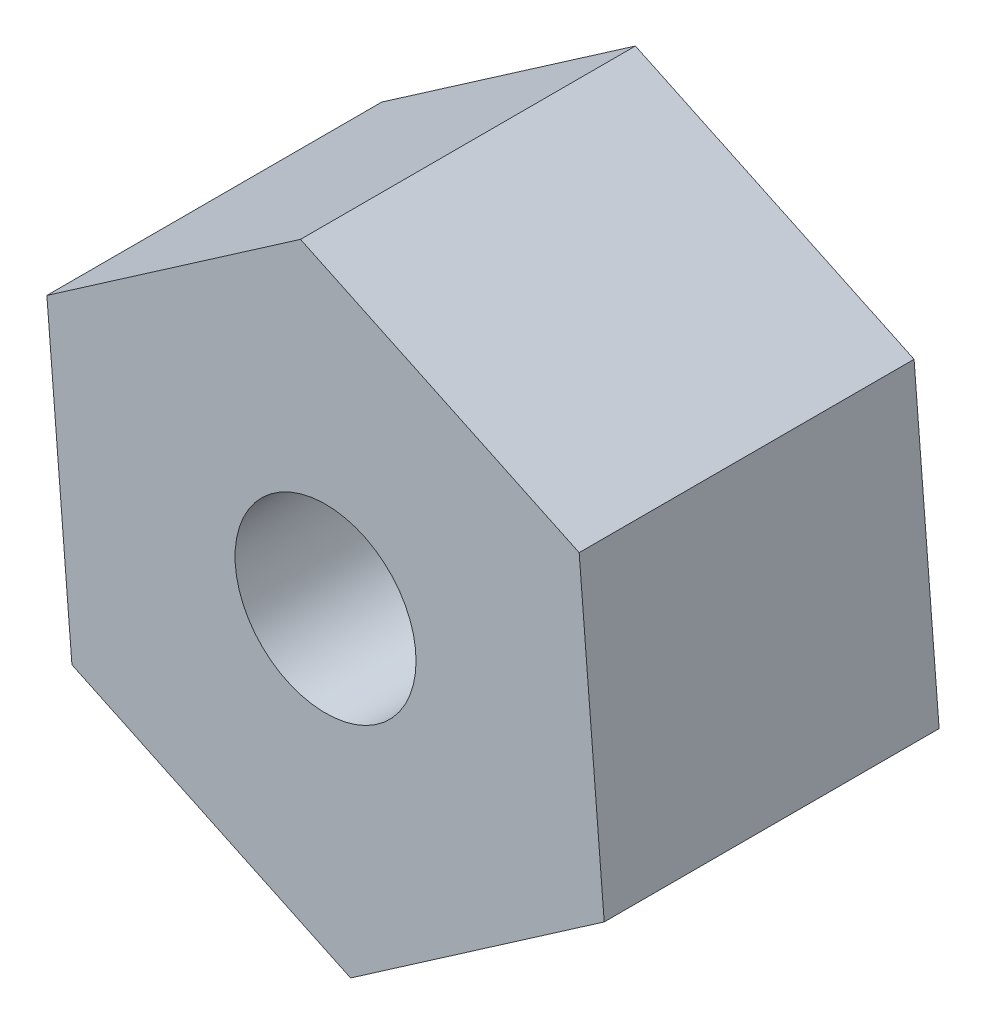
ISO-10303-21;
HEADER;
FILE_DESCRIPTION(('STEP AP214'),'2;1');
FILE_NAME('part.step','',(''),(''),'','','');
FILE_SCHEMA(('AUTOMOTIVE_DESIGN { 1 0 10303 214 1 1 1 1 }'));
ENDSEC;
DATA;
#1=APPLICATION_CONTEXT('core data for automotive mechanical design processes');
#2=APPLICATION_PROTOCOL_DEFINITION('international standard','automotive_design',2000,#1);
#3=PRODUCT_CONTEXT('',#1,'mechanical');
#4=PRODUCT('Part','Part','',(#3));
#5=PRODUCT_RELATED_PRODUCT_CATEGORY('part','',(#4));
#6=PRODUCT_DEFINITION_FORMATION('','',#4);
#7=PRODUCT_DEFINITION_CONTEXT('part definition',#1,'design');
#8=PRODUCT_DEFINITION('design','',#6,#7);
#9=PRODUCT_DEFINITION_SHAPE('','',#8);
#10=(LENGTH_UNIT() NAMED_UNIT(*) SI_UNIT(.MILLI.,.METRE.));
#11=(NAMED_UNIT(*) PLANE_ANGLE_UNIT() SI_UNIT($,.RADIAN.));
#12=(NAMED_UNIT(*) SI_UNIT($,.STERADIAN.) SOLID_ANGLE_UNIT());
#13=UNCERTAINTY_MEASURE_WITH_UNIT(LENGTH_MEASURE(1.E-05),#10,'distance_accuracy_value','');
#14=(GEOMETRIC_REPRESENTATION_CONTEXT(3) GLOBAL_UNCERTAINTY_ASSIGNED_CONTEXT((#13)) GLOBAL_UNIT_ASSIGNED_CONTEXT((#10,
#11,#12)) REPRESENTATION_CONTEXT('',''));
#15=CARTESIAN_POINT('',(0.,0.,0.));
#16=DIRECTION('',(0.,0.,1.));
#17=DIRECTION('',(1.,0.,0.));
#18=AXIS2_PLACEMENT_3D('',#15,#16,#17);
#19=CARTESIAN_POINT('',(0.,0.,3.7));
#20=DIRECTION('',(0.,0.,1.));
#21=DIRECTION('',(1.,0.,0.));
#22=AXIS2_PLACEMENT_3D('',#19,#20,#21);
#23=PLANE('',#22);
#24=DIRECTION('',(-0.903778262593263,0.428000995400599,0.));
#25=VECTOR('',#24,1.);
#26=CARTESIAN_POINT('',(2.80190297485983,1.93718172942163,3.7));
#27=LINE('',#26,#25);
#28=CARTESIAN_POINT('',(2.80190297485983,1.93718172942163,3.7));
#29=VERTEX_POINT('',#28);
#30=CARTESIAN_POINT('',(-0.276697101996294,3.39511001987862,3.7));
#31=VERTEX_POINT('',#30);
#32=EDGE_CURVE('E143',#29,#31,#27,.T.);
#33=ORIENTED_EDGE('',*,*,#32,.T.);
#34=DIRECTION('',(-0.822548866158576,-0.56869443709363,0.));
#35=VECTOR('',#34,1.);
#36=CARTESIAN_POINT('',(-0.276697101996294,3.39511001987862,3.7));
#37=LINE('',#36,#35);
#38=CARTESIAN_POINT('',(-3.07860007685612,1.45792829045698,3.7));
#39=VERTEX_POINT('',#38);
#40=EDGE_CURVE('E101',#31,#39,#37,.T.);
#41=ORIENTED_EDGE('',*,*,#40,.T.);
#42=DIRECTION('',(0.0812293964346863,-0.996695432494228,0.));
#43=VECTOR('',#42,1.);
#44=CARTESIAN_POINT('',(-3.07860007685612,1.45792829045698,3.7));
#45=LINE('',#44,#43);
#46=CARTESIAN_POINT('',(-2.80190297485983,-1.93718172942163,3.7));
#47=VERTEX_POINT('',#46);
#48=EDGE_CURVE('E114',#39,#47,#45,.T.);
#49=ORIENTED_EDGE('',*,*,#48,.T.);
#50=DIRECTION('',(0.903778262593263,-0.428000995400599,0.));
#51=VECTOR('',#50,1.);
#52=CARTESIAN_POINT('',(-2.80190297485983,-1.93718172942163,3.7));
#53=LINE('',#52,#51);
#54=CARTESIAN_POINT('',(0.276697101996293,-3.39511001987862,3.7));
#55=VERTEX_POINT('',#54);
#56=EDGE_CURVE('E108',#47,#55,#53,.T.);
#57=ORIENTED_EDGE('',*,*,#56,.T.);
#58=DIRECTION('',(0.822548866158576,0.56869443709363,0.));
#59=VECTOR('',#58,1.);
#60=CARTESIAN_POINT('',(0.276697101996293,-3.39511001987862,3.7));
#61=LINE('',#60,#59);
#62=CARTESIAN_POINT('',(3.07860007685612,-1.45792829045698,3.7));
#63=VERTEX_POINT('',#62);
#64=EDGE_CURVE('E112',#55,#63,#61,.T.);
#65=ORIENTED_EDGE('',*,*,#64,.T.);
#66=DIRECTION('',(-0.0812293964346861,0.996695432494228,0.));
#67=VECTOR('',#66,1.);
#68=CARTESIAN_POINT('',(3.07860007685612,-1.45792829045698,3.7));
#69=LINE('',#68,#67);
#70=EDGE_CURVE('E64',#63,#29,#69,.T.);
#71=ORIENTED_EDGE('',*,*,#70,.T.);
#72=EDGE_LOOP('',(#33,#41,#49,#57,#65,#71));
#73=FACE_BOUND('',#72,.T.);
#74=CARTESIAN_POINT('',(0.,0.,3.7));
#75=DIRECTION('',(0.,0.,1.));
#76=DIRECTION('',(1.,0.,0.));
#77=AXIS2_PLACEMENT_3D('',#74,#75,#76);
#78=CIRCLE('',#77,1.);
#79=CARTESIAN_POINT('',(1.,0.,3.7));
#80=VERTEX_POINT('',#79);
#81=EDGE_CURVE('E136',#80,#80,#78,.T.);
#82=ORIENTED_EDGE('',*,*,#81,.F.);
#83=EDGE_LOOP('',(#82));
#84=FACE_BOUND('',#83,.T.);
#85=ADVANCED_FACE('F47',(#73,#84),#23,.T.);
#86=CARTESIAN_POINT('',(0.,0.,0.));
#87=DIRECTION('',(0.,0.,1.));
#88=DIRECTION('',(1.,0.,0.));
#89=AXIS2_PLACEMENT_3D('',#86,#87,#88);
#90=PLANE('',#89);
#91=DIRECTION('',(-0.903778262593263,0.428000995400599,0.));
#92=VECTOR('',#91,1.);
#93=CARTESIAN_POINT('',(2.80190297485983,1.93718172942163,0.));
#94=LINE('',#93,#92);
#95=CARTESIAN_POINT('',(2.80190297485983,1.93718172942163,0.));
#96=VERTEX_POINT('',#95);
#97=CARTESIAN_POINT('',(-0.276697101996294,3.39511001987862,0.));
#98=VERTEX_POINT('',#97);
#99=EDGE_CURVE('E132',#96,#98,#94,.T.);
#100=ORIENTED_EDGE('',*,*,#99,.F.);
#101=DIRECTION('',(-0.0812293964346861,0.996695432494228,0.));
#102=VECTOR('',#101,1.);
#103=CARTESIAN_POINT('',(3.07860007685612,-1.45792829045698,0.));
#104=LINE('',#103,#102);
#105=CARTESIAN_POINT('',(3.07860007685612,-1.45792829045698,0.));
#106=VERTEX_POINT('',#105);
#107=EDGE_CURVE('E93',#106,#96,#104,.T.);
#108=ORIENTED_EDGE('',*,*,#107,.F.);
#109=DIRECTION('',(0.822548866158576,0.56869443709363,0.));
#110=VECTOR('',#109,1.);
#111=CARTESIAN_POINT('',(0.276697101996293,-3.39511001987862,0.));
#112=LINE('',#111,#110);
#113=CARTESIAN_POINT('',(0.276697101996293,-3.39511001987862,0.));
#114=VERTEX_POINT('',#113);
#115=EDGE_CURVE('E87',#114,#106,#112,.T.);
#116=ORIENTED_EDGE('',*,*,#115,.F.);
#117=DIRECTION('',(0.903778262593263,-0.428000995400599,0.));
#118=VECTOR('',#117,1.);
#119=CARTESIAN_POINT('',(-2.80190297485983,-1.93718172942163,0.));
#120=LINE('',#119,#118);
#121=CARTESIAN_POINT('',(-2.80190297485983,-1.93718172942163,0.));
#122=VERTEX_POINT('',#121);
#123=EDGE_CURVE('E122',#122,#114,#120,.T.);
#124=ORIENTED_EDGE('',*,*,#123,.F.);
#125=DIRECTION('',(0.0812293964346863,-0.996695432494228,0.));
#126=VECTOR('',#125,1.);
#127=CARTESIAN_POINT('',(-3.07860007685612,1.45792829045698,0.));
#128=LINE('',#127,#126);
#129=CARTESIAN_POINT('',(-3.07860007685612,1.45792829045698,0.));
#130=VERTEX_POINT('',#129);
#131=EDGE_CURVE('E138',#130,#122,#128,.T.);
#132=ORIENTED_EDGE('',*,*,#131,.F.);
#133=DIRECTION('',(-0.822548866158576,-0.56869443709363,0.));
#134=VECTOR('',#133,1.);
#135=CARTESIAN_POINT('',(-0.276697101996294,3.39511001987862,0.));
#136=LINE('',#135,#134);
#137=EDGE_CURVE('E135',#98,#130,#136,.T.);
#138=ORIENTED_EDGE('',*,*,#137,.F.);
#139=EDGE_LOOP('',(#100,#108,#116,#124,#132,#138));
#140=FACE_BOUND('',#139,.T.);
#141=CARTESIAN_POINT('',(0.,0.,0.));
#142=DIRECTION('',(0.,0.,1.));
#143=DIRECTION('',(1.,0.,0.));
#144=AXIS2_PLACEMENT_3D('',#141,#142,#143);
#145=CIRCLE('',#144,1.);
#146=CARTESIAN_POINT('',(1.,0.,0.));
#147=VERTEX_POINT('',#146);
#148=EDGE_CURVE('E248',#147,#147,#145,.T.);
#149=ORIENTED_EDGE('',*,*,#148,.T.);
#150=EDGE_LOOP('',(#149));
#151=FACE_BOUND('',#150,.T.);
#152=ADVANCED_FACE('F152',(#140,#151),#90,.F.);
#153=CARTESIAN_POINT('',(2.80190297485983,1.93718172942163,3.7));
#154=DIRECTION('',(-0.428000995400598,-0.903778262593263,0.));
#155=DIRECTION('',(0.903778262593263,-0.428000995400598,0.));
#156=AXIS2_PLACEMENT_3D('',#153,#154,#155);
#157=PLANE('',#156);
#158=ORIENTED_EDGE('',*,*,#99,.T.);
#159=DIRECTION('',(0.,0.,-1.));
#160=VECTOR('',#159,1.);
#161=CARTESIAN_POINT('',(-0.276697101996294,3.39511001987862,3.7));
#162=LINE('',#161,#160);
#163=EDGE_CURVE('E11',#31,#98,#162,.T.);
#164=ORIENTED_EDGE('',*,*,#163,.F.);
#165=ORIENTED_EDGE('',*,*,#32,.F.);
#166=DIRECTION('',(0.,0.,-1.));
#167=VECTOR('',#166,1.);
#168=CARTESIAN_POINT('',(2.80190297485983,1.93718172942163,3.7));
#169=LINE('',#168,#167);
#170=EDGE_CURVE('E128',#29,#96,#169,.T.);
#171=ORIENTED_EDGE('',*,*,#170,.T.);
#172=EDGE_LOOP('',(#158,#164,#165,#171));
#173=FACE_BOUND('',#172,.T.);
#174=ADVANCED_FACE('F49',(#173),#157,.F.);
#175=CARTESIAN_POINT('',(-0.276697101996294,3.39511001987862,3.7));
#176=DIRECTION('',(0.56869443709363,-0.822548866158577,0.));
#177=DIRECTION('',(0.822548866158576,0.56869443709363,0.));
#178=AXIS2_PLACEMENT_3D('',#175,#176,#177);
#179=PLANE('',#178);
#180=ORIENTED_EDGE('',*,*,#137,.T.);
#181=DIRECTION('',(0.,0.,-1.));
#182=VECTOR('',#181,1.);
#183=CARTESIAN_POINT('',(-3.07860007685612,1.45792829045698,3.7));
#184=LINE('',#183,#182);
#185=EDGE_CURVE('E56',#39,#130,#184,.T.);
#186=ORIENTED_EDGE('',*,*,#185,.F.);
#187=ORIENTED_EDGE('',*,*,#40,.F.);
#188=ORIENTED_EDGE('',*,*,#163,.T.);
#189=EDGE_LOOP('',(#180,#186,#187,#188));
#190=FACE_BOUND('',#189,.T.);
#191=ADVANCED_FACE('F180',(#190),#179,.F.);
#192=CARTESIAN_POINT('',(-3.07860007685612,1.45792829045698,3.7));
#193=DIRECTION('',(0.996695432494228,0.0812293964346863,0.));
#194=DIRECTION('',(-0.0812293964346863,0.996695432494228,0.));
#195=AXIS2_PLACEMENT_3D('',#192,#193,#194);
#196=PLANE('',#195);
#197=ORIENTED_EDGE('',*,*,#131,.T.);
#198=DIRECTION('',(0.,0.,-1.));
#199=VECTOR('',#198,1.);
#200=CARTESIAN_POINT('',(-2.80190297485983,-1.93718172942163,3.7));
#201=LINE('',#200,#199);
#202=EDGE_CURVE('E123',#47,#122,#201,.T.);
#203=ORIENTED_EDGE('',*,*,#202,.F.);
#204=ORIENTED_EDGE('',*,*,#48,.F.);
#205=ORIENTED_EDGE('',*,*,#185,.T.);
#206=EDGE_LOOP('',(#197,#203,#204,#205));
#207=FACE_BOUND('',#206,.T.);
#208=ADVANCED_FACE('F149',(#207),#196,.F.);
#209=CARTESIAN_POINT('',(-2.80190297485983,-1.93718172942163,3.7));
#210=DIRECTION('',(0.428000995400599,0.903778262593263,0.));
#211=DIRECTION('',(-0.903778262593263,0.428000995400599,0.));
#212=AXIS2_PLACEMENT_3D('',#209,#210,#211);
#213=PLANE('',#212);
#214=ORIENTED_EDGE('',*,*,#123,.T.);
#215=DIRECTION('',(0.,0.,-1.));
#216=VECTOR('',#215,1.);
#217=CARTESIAN_POINT('',(0.276697101996293,-3.39511001987862,3.7));
#218=LINE('',#217,#216);
#219=EDGE_CURVE('E119',#55,#114,#218,.T.);
#220=ORIENTED_EDGE('',*,*,#219,.F.);
#221=ORIENTED_EDGE('',*,*,#56,.F.);
#222=ORIENTED_EDGE('',*,*,#202,.T.);
#223=EDGE_LOOP('',(#214,#220,#221,#222));
#224=FACE_BOUND('',#223,.T.);
#225=ADVANCED_FACE('F120',(#224),#213,.F.);
#226=CARTESIAN_POINT('',(0.276697101996293,-3.39511001987862,3.7));
#227=DIRECTION('',(-0.56869443709363,0.822548866158576,0.));
#228=DIRECTION('',(-0.822548866158576,-0.56869443709363,0.));
#229=AXIS2_PLACEMENT_3D('',#226,#227,#228);
#230=PLANE('',#229);
#231=ORIENTED_EDGE('',*,*,#115,.T.);
#232=DIRECTION('',(0.,0.,-1.));
#233=VECTOR('',#232,1.);
#234=CARTESIAN_POINT('',(3.07860007685612,-1.45792829045698,3.7));
#235=LINE('',#234,#233);
#236=EDGE_CURVE('E124',#63,#106,#235,.T.);
#237=ORIENTED_EDGE('',*,*,#236,.F.);
#238=ORIENTED_EDGE('',*,*,#64,.F.);
#239=ORIENTED_EDGE('',*,*,#219,.T.);
#240=EDGE_LOOP('',(#231,#237,#238,#239));
#241=FACE_BOUND('',#240,.T.);
#242=ADVANCED_FACE('F126',(#241),#230,.F.);
#243=CARTESIAN_POINT('',(3.07860007685612,-1.45792829045698,3.7));
#244=DIRECTION('',(-0.996695432494228,-0.0812293964346861,0.));
#245=DIRECTION('',(0.0812293964346861,-0.996695432494228,0.));
#246=AXIS2_PLACEMENT_3D('',#243,#244,#245);
#247=PLANE('',#246);
#248=ORIENTED_EDGE('',*,*,#107,.T.);
#249=ORIENTED_EDGE('',*,*,#170,.F.);
#250=ORIENTED_EDGE('',*,*,#70,.F.);
#251=ORIENTED_EDGE('',*,*,#236,.T.);
#252=EDGE_LOOP('',(#248,#249,#250,#251));
#253=FACE_BOUND('',#252,.T.);
#254=ADVANCED_FACE('F157',(#253),#247,.F.);
#255=CARTESIAN_POINT('',(0.,0.,3.7));
#256=DIRECTION('',(0.,0.,-1.));
#257=DIRECTION('',(-1.,0.,0.));
#258=AXIS2_PLACEMENT_3D('',#255,#256,#257);
#259=CYLINDRICAL_SURFACE('',#258,1.);
#260=ORIENTED_EDGE('',*,*,#81,.T.);
#261=EDGE_LOOP('',(#260));
#262=FACE_BOUND('',#261,.T.);
#263=ORIENTED_EDGE('',*,*,#148,.F.);
#264=EDGE_LOOP('',(#263));
#265=FACE_BOUND('',#264,.T.);
#266=ADVANCED_FACE('F159',(#262,#265),#259,.F.);
#267=CLOSED_SHELL('',(#85,#152,#174,#191,#208,#225,#242,#254,#266));
#268=MANIFOLD_SOLID_BREP('B2',#267);
#269=ADVANCED_BREP_SHAPE_REPRESENTATION('',(#18,#268),#14);
#270=SHAPE_DEFINITION_REPRESENTATION(#9,#269);
ENDSEC;
END-ISO-10303-21;
